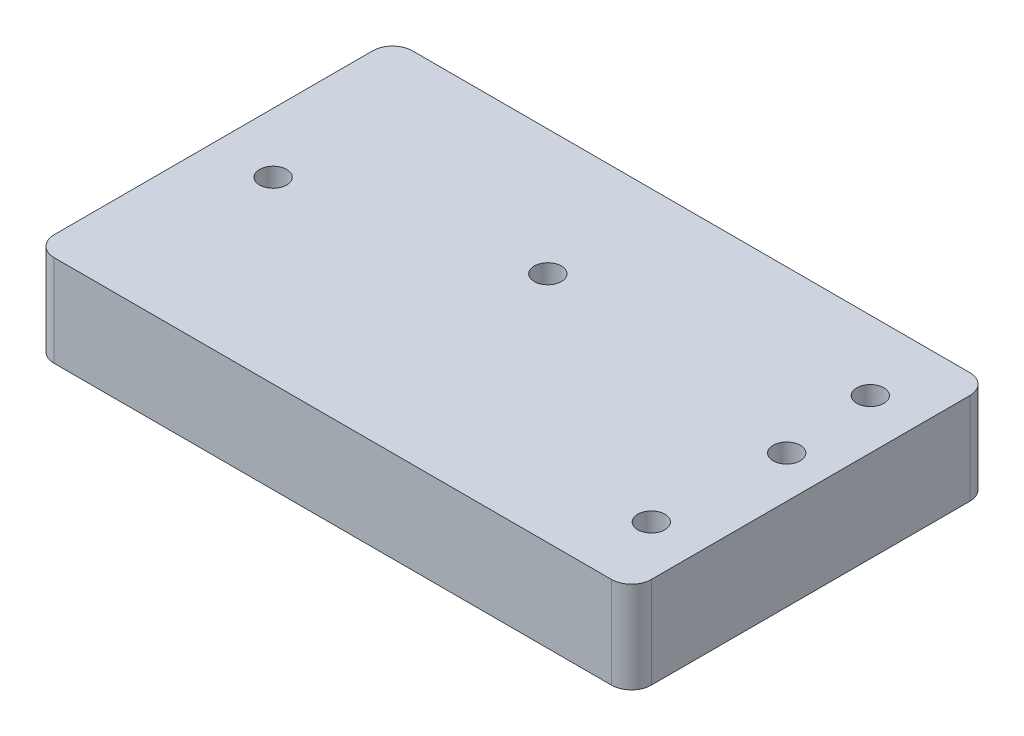
ISO-10303-21;
HEADER;
FILE_DESCRIPTION(('STEP AP214'),'2;1');
FILE_NAME('part.step','',(''),(''),'','','');
FILE_SCHEMA(('AUTOMOTIVE_DESIGN { 1 0 10303 214 1 1 1 1 }'));
ENDSEC;
DATA;
#1=APPLICATION_CONTEXT('core data for automotive mechanical design processes');
#2=APPLICATION_PROTOCOL_DEFINITION('international standard','automotive_design',2000,#1);
#3=PRODUCT_CONTEXT('',#1,'mechanical');
#4=PRODUCT('Part','Part','',(#3));
#5=PRODUCT_RELATED_PRODUCT_CATEGORY('part','',(#4));
#6=PRODUCT_DEFINITION_FORMATION('','',#4);
#7=PRODUCT_DEFINITION_CONTEXT('part definition',#1,'design');
#8=PRODUCT_DEFINITION('design','',#6,#7);
#9=PRODUCT_DEFINITION_SHAPE('','',#8);
#10=(LENGTH_UNIT() NAMED_UNIT(*) SI_UNIT(.MILLI.,.METRE.));
#11=(NAMED_UNIT(*) PLANE_ANGLE_UNIT() SI_UNIT($,.RADIAN.));
#12=(NAMED_UNIT(*) SI_UNIT($,.STERADIAN.) SOLID_ANGLE_UNIT());
#13=UNCERTAINTY_MEASURE_WITH_UNIT(LENGTH_MEASURE(1.E-05),#10,'distance_accuracy_value','');
#14=(GEOMETRIC_REPRESENTATION_CONTEXT(3) GLOBAL_UNCERTAINTY_ASSIGNED_CONTEXT((#13)) GLOBAL_UNIT_ASSIGNED_CONTEXT((#10,
#11,#12)) REPRESENTATION_CONTEXT('',''));
#15=CARTESIAN_POINT('',(0.,0.,0.));
#16=DIRECTION('',(0.,0.,1.));
#17=DIRECTION('',(1.,0.,0.));
#18=AXIS2_PLACEMENT_3D('',#15,#16,#17);
#19=CARTESIAN_POINT('',(0.,11.684,0.));
#20=DIRECTION('',(1.,0.,0.));
#21=DIRECTION('',(0.,0.,-1.));
#22=AXIS2_PLACEMENT_3D('',#19,#20,#21);
#23=PLANE('',#22);
#24=CARTESIAN_POINT('',(0.,9.017,27.94));
#25=DIRECTION('',(-1.,0.,0.));
#26=DIRECTION('',(0.,0.,1.));
#27=AXIS2_PLACEMENT_3D('',#24,#25,#26);
#28=CIRCLE('',#27,1.397);
#29=CARTESIAN_POINT('',(0.,9.017,29.337));
#30=VERTEX_POINT('',#29);
#31=EDGE_CURVE('E260',#30,#30,#28,.T.);
#32=ORIENTED_EDGE('',*,*,#31,.F.);
#33=EDGE_LOOP('',(#32));
#34=FACE_BOUND('',#33,.T.);
#35=DIRECTION('',(0.,0.,1.));
#36=VECTOR('',#35,1.);
#37=CARTESIAN_POINT('',(0.,0.,0.));
#38=LINE('',#37,#36);
#39=CARTESIAN_POINT('',(0.,0.,2.54));
#40=VERTEX_POINT('',#39);
#41=CARTESIAN_POINT('',(0.,0.,43.18));
#42=VERTEX_POINT('',#41);
#43=EDGE_CURVE('E289',#40,#42,#38,.T.);
#44=ORIENTED_EDGE('',*,*,#43,.T.);
#45=DIRECTION('',(0.,-1.,0.));
#46=VECTOR('',#45,1.);
#47=CARTESIAN_POINT('',(0.,11.684,43.18));
#48=LINE('',#47,#46);
#49=CARTESIAN_POINT('',(0.,11.684,43.18));
#50=VERTEX_POINT('',#49);
#51=EDGE_CURVE('E344',#42,#50,#48,.F.);
#52=ORIENTED_EDGE('',*,*,#51,.T.);
#53=DIRECTION('',(0.,0.,1.));
#54=VECTOR('',#53,1.);
#55=CARTESIAN_POINT('',(0.,11.684,0.));
#56=LINE('',#55,#54);
#57=CARTESIAN_POINT('',(0.,11.684,2.54));
#58=VERTEX_POINT('',#57);
#59=EDGE_CURVE('E293',#58,#50,#56,.T.);
#60=ORIENTED_EDGE('',*,*,#59,.F.);
#61=DIRECTION('',(0.,-1.,0.));
#62=VECTOR('',#61,1.);
#63=CARTESIAN_POINT('',(0.,11.684,2.54));
#64=LINE('',#63,#62);
#65=EDGE_CURVE('E340',#58,#40,#64,.T.);
#66=ORIENTED_EDGE('',*,*,#65,.T.);
#67=EDGE_LOOP('',(#44,#52,#60,#66));
#68=FACE_BOUND('',#67,.T.);
#69=ADVANCED_FACE('F140',(#34,#68),#23,.F.);
#70=CARTESIAN_POINT('',(0.,11.684,45.72));
#71=DIRECTION('',(0.,0.,-1.));
#72=DIRECTION('',(-1.,0.,0.));
#73=AXIS2_PLACEMENT_3D('',#70,#71,#72);
#74=PLANE('',#73);
#75=DIRECTION('',(1.,0.,0.));
#76=VECTOR('',#75,1.);
#77=CARTESIAN_POINT('',(0.,11.684,45.72));
#78=LINE('',#77,#76);
#79=CARTESIAN_POINT('',(2.54,11.684,45.72));
#80=VERTEX_POINT('',#79);
#81=CARTESIAN_POINT('',(73.66,11.684,45.72));
#82=VERTEX_POINT('',#81);
#83=EDGE_CURVE('E297',#80,#82,#78,.T.);
#84=ORIENTED_EDGE('',*,*,#83,.F.);
#85=DIRECTION('',(0.,-1.,0.));
#86=VECTOR('',#85,1.);
#87=CARTESIAN_POINT('',(2.54,11.684,45.72));
#88=LINE('',#87,#86);
#89=CARTESIAN_POINT('',(2.54,0.,45.72));
#90=VERTEX_POINT('',#89);
#91=EDGE_CURVE('E324',#80,#90,#88,.T.);
#92=ORIENTED_EDGE('',*,*,#91,.T.);
#93=DIRECTION('',(1.,0.,0.));
#94=VECTOR('',#93,1.);
#95=CARTESIAN_POINT('',(0.,0.,45.72));
#96=LINE('',#95,#94);
#97=CARTESIAN_POINT('',(73.66,0.,45.72));
#98=VERTEX_POINT('',#97);
#99=EDGE_CURVE('E312',#90,#98,#96,.T.);
#100=ORIENTED_EDGE('',*,*,#99,.T.);
#101=DIRECTION('',(0.,-1.,0.));
#102=VECTOR('',#101,1.);
#103=CARTESIAN_POINT('',(73.66,11.684,45.72));
#104=LINE('',#103,#102);
#105=EDGE_CURVE('E308',#98,#82,#104,.F.);
#106=ORIENTED_EDGE('',*,*,#105,.T.);
#107=EDGE_LOOP('',(#84,#92,#100,#106));
#108=FACE_BOUND('',#107,.T.);
#109=ADVANCED_FACE('F389',(#108),#74,.F.);
#110=CARTESIAN_POINT('',(76.2,11.684,0.));
#111=DIRECTION('',(-1.,0.,0.));
#112=DIRECTION('',(0.,0.,1.));
#113=AXIS2_PLACEMENT_3D('',#110,#111,#112);
#114=PLANE('',#113);
#115=DIRECTION('',(0.,0.,-1.));
#116=VECTOR('',#115,1.);
#117=CARTESIAN_POINT('',(76.2,11.684,0.));
#118=LINE('',#117,#116);
#119=CARTESIAN_POINT('',(76.2,11.684,43.18));
#120=VERTEX_POINT('',#119);
#121=CARTESIAN_POINT('',(76.2,11.684,2.54));
#122=VERTEX_POINT('',#121);
#123=EDGE_CURVE('E302',#120,#122,#118,.T.);
#124=ORIENTED_EDGE('',*,*,#123,.F.);
#125=DIRECTION('',(0.,-1.,0.));
#126=VECTOR('',#125,1.);
#127=CARTESIAN_POINT('',(76.2,11.684,43.18));
#128=LINE('',#127,#126);
#129=CARTESIAN_POINT('',(76.2,0.,43.18));
#130=VERTEX_POINT('',#129);
#131=EDGE_CURVE('E361',#120,#130,#128,.T.);
#132=ORIENTED_EDGE('',*,*,#131,.T.);
#133=DIRECTION('',(0.,0.,-1.));
#134=VECTOR('',#133,1.);
#135=CARTESIAN_POINT('',(76.2,0.,0.));
#136=LINE('',#135,#134);
#137=CARTESIAN_POINT('',(76.2,0.,2.54));
#138=VERTEX_POINT('',#137);
#139=EDGE_CURVE('E316',#130,#138,#136,.T.);
#140=ORIENTED_EDGE('',*,*,#139,.T.);
#141=DIRECTION('',(0.,-1.,0.));
#142=VECTOR('',#141,1.);
#143=CARTESIAN_POINT('',(76.2,11.684,2.54));
#144=LINE('',#143,#142);
#145=EDGE_CURVE('E358',#138,#122,#144,.F.);
#146=ORIENTED_EDGE('',*,*,#145,.T.);
#147=EDGE_LOOP('',(#124,#132,#140,#146));
#148=FACE_BOUND('',#147,.T.);
#149=ADVANCED_FACE('F397',(#148),#114,.F.);
#150=CARTESIAN_POINT('',(0.,11.684,0.));
#151=DIRECTION('',(0.,0.,1.));
#152=DIRECTION('',(1.,0.,0.));
#153=AXIS2_PLACEMENT_3D('',#150,#151,#152);
#154=PLANE('',#153);
#155=DIRECTION('',(-1.,0.,0.));
#156=VECTOR('',#155,1.);
#157=CARTESIAN_POINT('',(0.,0.,0.));
#158=LINE('',#157,#156);
#159=CARTESIAN_POINT('',(73.66,0.,0.));
#160=VERTEX_POINT('',#159);
#161=CARTESIAN_POINT('',(2.54,0.,0.));
#162=VERTEX_POINT('',#161);
#163=EDGE_CURVE('E298',#160,#162,#158,.T.);
#164=ORIENTED_EDGE('',*,*,#163,.T.);
#165=DIRECTION('',(0.,-1.,0.));
#166=VECTOR('',#165,1.);
#167=CARTESIAN_POINT('',(2.54,11.684,0.));
#168=LINE('',#167,#166);
#169=CARTESIAN_POINT('',(2.54,11.684,0.));
#170=VERTEX_POINT('',#169);
#171=EDGE_CURVE('E12',#162,#170,#168,.F.);
#172=ORIENTED_EDGE('',*,*,#171,.T.);
#173=DIRECTION('',(-1.,0.,0.));
#174=VECTOR('',#173,1.);
#175=CARTESIAN_POINT('',(0.,11.684,0.));
#176=LINE('',#175,#174);
#177=CARTESIAN_POINT('',(73.66,11.684,0.));
#178=VERTEX_POINT('',#177);
#179=EDGE_CURVE('E305',#178,#170,#176,.T.);
#180=ORIENTED_EDGE('',*,*,#179,.F.);
#181=DIRECTION('',(0.,-1.,0.));
#182=VECTOR('',#181,1.);
#183=CARTESIAN_POINT('',(73.66,11.684,0.));
#184=LINE('',#183,#182);
#185=EDGE_CURVE('E149',#178,#160,#184,.T.);
#186=ORIENTED_EDGE('',*,*,#185,.T.);
#187=EDGE_LOOP('',(#164,#172,#180,#186));
#188=FACE_BOUND('',#187,.T.);
#189=ADVANCED_FACE('F368',(#188),#154,.F.);
#190=CARTESIAN_POINT('',(0.,11.684,0.));
#191=DIRECTION('',(0.,1.,0.));
#192=DIRECTION('',(0.,0.,1.));
#193=AXIS2_PLACEMENT_3D('',#190,#191,#192);
#194=PLANE('',#193);
#195=CARTESIAN_POINT('',(35.814,11.684,16.002));
#196=DIRECTION('',(0.,1.,0.));
#197=DIRECTION('',(0.,0.,1.));
#198=AXIS2_PLACEMENT_3D('',#195,#196,#197);
#199=CIRCLE('',#198,1.72719999999999);
#200=CARTESIAN_POINT('',(35.814,11.684,17.7292));
#201=VERTEX_POINT('',#200);
#202=EDGE_CURVE('E689',#201,#201,#199,.T.);
#203=ORIENTED_EDGE('',*,*,#202,.F.);
#204=EDGE_LOOP('',(#203));
#205=FACE_BOUND('',#204,.T.);
#206=CARTESIAN_POINT('',(70.866,11.684,20.574));
#207=DIRECTION('',(0.,1.,0.));
#208=DIRECTION('',(0.,0.,1.));
#209=AXIS2_PLACEMENT_3D('',#206,#207,#208);
#210=CIRCLE('',#209,1.7272);
#211=CARTESIAN_POINT('',(70.866,11.684,22.3012));
#212=VERTEX_POINT('',#211);
#213=EDGE_CURVE('E237',#212,#212,#210,.T.);
#214=ORIENTED_EDGE('',*,*,#213,.F.);
#215=EDGE_LOOP('',(#214));
#216=FACE_BOUND('',#215,.T.);
#217=CARTESIAN_POINT('',(69.85,11.684,36.83));
#218=DIRECTION('',(0.,1.,0.));
#219=DIRECTION('',(0.,0.,1.));
#220=AXIS2_PLACEMENT_3D('',#217,#218,#219);
#221=CIRCLE('',#220,1.7272);
#222=CARTESIAN_POINT('',(69.85,11.684,38.5572));
#223=VERTEX_POINT('',#222);
#224=EDGE_CURVE('E265',#223,#223,#221,.T.);
#225=ORIENTED_EDGE('',*,*,#224,.F.);
#226=EDGE_LOOP('',(#225));
#227=FACE_BOUND('',#226,.T.);
#228=CARTESIAN_POINT('',(69.85,11.684,8.89));
#229=DIRECTION('',(0.,1.,0.));
#230=DIRECTION('',(0.,0.,1.));
#231=AXIS2_PLACEMENT_3D('',#228,#229,#230);
#232=CIRCLE('',#231,1.7272);
#233=CARTESIAN_POINT('',(69.85,11.684,10.6172));
#234=VERTEX_POINT('',#233);
#235=EDGE_CURVE('E273',#234,#234,#232,.T.);
#236=ORIENTED_EDGE('',*,*,#235,.F.);
#237=EDGE_LOOP('',(#236));
#238=FACE_BOUND('',#237,.T.);
#239=CARTESIAN_POINT('',(7.62,11.684,22.86));
#240=DIRECTION('',(0.,1.,0.));
#241=DIRECTION('',(0.,0.,1.));
#242=AXIS2_PLACEMENT_3D('',#239,#240,#241);
#243=CIRCLE('',#242,1.7272);
#244=CARTESIAN_POINT('',(7.62,11.684,24.5872));
#245=VERTEX_POINT('',#244);
#246=EDGE_CURVE('E281',#245,#245,#243,.T.);
#247=ORIENTED_EDGE('',*,*,#246,.F.);
#248=EDGE_LOOP('',(#247));
#249=FACE_BOUND('',#248,.T.);
#250=ORIENTED_EDGE('',*,*,#59,.T.);
#251=CARTESIAN_POINT('',(2.54,11.684,43.18));
#252=DIRECTION('',(0.,1.,0.));
#253=DIRECTION('',(0.,0.,1.));
#254=AXIS2_PLACEMENT_3D('',#251,#252,#253);
#255=CIRCLE('',#254,2.54);
#256=EDGE_CURVE('E355',#50,#80,#255,.T.);
#257=ORIENTED_EDGE('',*,*,#256,.T.);
#258=ORIENTED_EDGE('',*,*,#83,.T.);
#259=CARTESIAN_POINT('',(73.66,11.684,43.18));
#260=DIRECTION('',(0.,1.,0.));
#261=DIRECTION('',(0.,0.,1.));
#262=AXIS2_PLACEMENT_3D('',#259,#260,#261);
#263=CIRCLE('',#262,2.54);
#264=EDGE_CURVE('E352',#82,#120,#263,.T.);
#265=ORIENTED_EDGE('',*,*,#264,.T.);
#266=ORIENTED_EDGE('',*,*,#123,.T.);
#267=CARTESIAN_POINT('',(73.66,11.684,2.54));
#268=DIRECTION('',(0.,1.,0.));
#269=DIRECTION('',(0.,0.,1.));
#270=AXIS2_PLACEMENT_3D('',#267,#268,#269);
#271=CIRCLE('',#270,2.54);
#272=EDGE_CURVE('E161',#122,#178,#271,.T.);
#273=ORIENTED_EDGE('',*,*,#272,.T.);
#274=ORIENTED_EDGE('',*,*,#179,.T.);
#275=CARTESIAN_POINT('',(2.54,11.684,2.54));
#276=DIRECTION('',(0.,1.,0.));
#277=DIRECTION('',(0.,0.,1.));
#278=AXIS2_PLACEMENT_3D('',#275,#276,#277);
#279=CIRCLE('',#278,2.54);
#280=EDGE_CURVE('E349',#170,#58,#279,.T.);
#281=ORIENTED_EDGE('',*,*,#280,.T.);
#282=EDGE_LOOP('',(#250,#257,#258,#265,#266,#273,#274,#281));
#283=FACE_BOUND('',#282,.T.);
#284=ADVANCED_FACE('F383',(#205,#216,#227,#238,#249,#283),#194,.T.);
#285=CARTESIAN_POINT('',(0.,0.,0.));
#286=DIRECTION('',(0.,1.,0.));
#287=DIRECTION('',(0.,0.,1.));
#288=AXIS2_PLACEMENT_3D('',#285,#286,#287);
#289=PLANE('',#288);
#290=CARTESIAN_POINT('',(35.814,0.,16.002));
#291=DIRECTION('',(0.,-1.,0.));
#292=DIRECTION('',(0.,0.,-1.));
#293=AXIS2_PLACEMENT_3D('',#290,#291,#292);
#294=CIRCLE('',#293,1.72719999999999);
#295=CARTESIAN_POINT('',(35.814,0.,14.2748));
#296=VERTEX_POINT('',#295);
#297=EDGE_CURVE('E710',#296,#296,#294,.T.);
#298=ORIENTED_EDGE('',*,*,#297,.F.);
#299=EDGE_LOOP('',(#298));
#300=FACE_BOUND('',#299,.T.);
#301=CARTESIAN_POINT('',(70.866,0.,20.574));
#302=DIRECTION('',(0.,-1.,0.));
#303=DIRECTION('',(0.,0.,-1.));
#304=AXIS2_PLACEMENT_3D('',#301,#302,#303);
#305=CIRCLE('',#304,1.7272);
#306=CARTESIAN_POINT('',(70.866,0.,18.8468));
#307=VERTEX_POINT('',#306);
#308=EDGE_CURVE('E702',#307,#307,#305,.T.);
#309=ORIENTED_EDGE('',*,*,#308,.F.);
#310=EDGE_LOOP('',(#309));
#311=FACE_BOUND('',#310,.T.);
#312=CARTESIAN_POINT('',(3.175,0.,3.5052));
#313=DIRECTION('',(0.,-1.,0.));
#314=DIRECTION('',(0.,0.,-1.));
#315=AXIS2_PLACEMENT_3D('',#312,#313,#314);
#316=CIRCLE('',#315,1.1303);
#317=CARTESIAN_POINT('',(3.175,0.,2.3749));
#318=VERTEX_POINT('',#317);
#319=EDGE_CURVE('E228',#318,#318,#316,.T.);
#320=ORIENTED_EDGE('',*,*,#319,.F.);
#321=EDGE_LOOP('',(#320));
#322=FACE_BOUND('',#321,.T.);
#323=CARTESIAN_POINT('',(3.175,0.,37.1602));
#324=DIRECTION('',(0.,-1.,0.));
#325=DIRECTION('',(0.,0.,-1.));
#326=AXIS2_PLACEMENT_3D('',#323,#324,#325);
#327=CIRCLE('',#326,1.1303);
#328=CARTESIAN_POINT('',(3.175,0.,36.0299));
#329=VERTEX_POINT('',#328);
#330=EDGE_CURVE('E227',#329,#329,#327,.T.);
#331=ORIENTED_EDGE('',*,*,#330,.F.);
#332=EDGE_LOOP('',(#331));
#333=FACE_BOUND('',#332,.T.);
#334=CARTESIAN_POINT('',(14.605,0.,3.5052));
#335=DIRECTION('',(0.,-1.,0.));
#336=DIRECTION('',(0.,0.,-1.));
#337=AXIS2_PLACEMENT_3D('',#334,#335,#336);
#338=CIRCLE('',#337,1.1303);
#339=CARTESIAN_POINT('',(14.605,0.,2.3749));
#340=VERTEX_POINT('',#339);
#341=EDGE_CURVE('E244',#340,#340,#338,.T.);
#342=ORIENTED_EDGE('',*,*,#341,.F.);
#343=EDGE_LOOP('',(#342));
#344=FACE_BOUND('',#343,.T.);
#345=CARTESIAN_POINT('',(14.605,0.,37.1602));
#346=DIRECTION('',(0.,-1.,0.));
#347=DIRECTION('',(0.,0.,-1.));
#348=AXIS2_PLACEMENT_3D('',#345,#346,#347);
#349=CIRCLE('',#348,1.1303);
#350=CARTESIAN_POINT('',(14.605,0.,36.0299));
#351=VERTEX_POINT('',#350);
#352=EDGE_CURVE('E252',#351,#351,#349,.T.);
#353=ORIENTED_EDGE('',*,*,#352,.F.);
#354=EDGE_LOOP('',(#353));
#355=FACE_BOUND('',#354,.T.);
#356=CARTESIAN_POINT('',(69.85,0.,36.83));
#357=DIRECTION('',(0.,1.,0.));
#358=DIRECTION('',(0.,0.,1.));
#359=AXIS2_PLACEMENT_3D('',#356,#357,#358);
#360=CIRCLE('',#359,1.7272);
#361=CARTESIAN_POINT('',(69.85,0.,38.5572));
#362=VERTEX_POINT('',#361);
#363=EDGE_CURVE('E269',#362,#362,#360,.T.);
#364=ORIENTED_EDGE('',*,*,#363,.T.);
#365=EDGE_LOOP('',(#364));
#366=FACE_BOUND('',#365,.T.);
#367=CARTESIAN_POINT('',(69.85,0.,8.89));
#368=DIRECTION('',(0.,1.,0.));
#369=DIRECTION('',(0.,0.,1.));
#370=AXIS2_PLACEMENT_3D('',#367,#368,#369);
#371=CIRCLE('',#370,1.7272);
#372=CARTESIAN_POINT('',(69.85,0.,10.6172));
#373=VERTEX_POINT('',#372);
#374=EDGE_CURVE('E277',#373,#373,#371,.T.);
#375=ORIENTED_EDGE('',*,*,#374,.T.);
#376=EDGE_LOOP('',(#375));
#377=FACE_BOUND('',#376,.T.);
#378=CARTESIAN_POINT('',(7.62,0.,22.86));
#379=DIRECTION('',(0.,1.,0.));
#380=DIRECTION('',(0.,0.,1.));
#381=AXIS2_PLACEMENT_3D('',#378,#379,#380);
#382=CIRCLE('',#381,1.7272);
#383=CARTESIAN_POINT('',(7.62,0.,24.5872));
#384=VERTEX_POINT('',#383);
#385=EDGE_CURVE('E285',#384,#384,#382,.T.);
#386=ORIENTED_EDGE('',*,*,#385,.T.);
#387=EDGE_LOOP('',(#386));
#388=FACE_BOUND('',#387,.T.);
#389=ORIENTED_EDGE('',*,*,#99,.F.);
#390=CARTESIAN_POINT('',(2.54,0.,43.18));
#391=DIRECTION('',(0.,1.,0.));
#392=DIRECTION('',(0.,0.,1.));
#393=AXIS2_PLACEMENT_3D('',#390,#391,#392);
#394=CIRCLE('',#393,2.54);
#395=EDGE_CURVE('E337',#90,#42,#394,.F.);
#396=ORIENTED_EDGE('',*,*,#395,.T.);
#397=ORIENTED_EDGE('',*,*,#43,.F.);
#398=CARTESIAN_POINT('',(2.54,0.,2.54));
#399=DIRECTION('',(0.,1.,0.));
#400=DIRECTION('',(0.,0.,1.));
#401=AXIS2_PLACEMENT_3D('',#398,#399,#400);
#402=CIRCLE('',#401,2.54);
#403=EDGE_CURVE('E331',#40,#162,#402,.F.);
#404=ORIENTED_EDGE('',*,*,#403,.T.);
#405=ORIENTED_EDGE('',*,*,#163,.F.);
#406=CARTESIAN_POINT('',(73.66,0.,2.54));
#407=DIRECTION('',(0.,1.,0.));
#408=DIRECTION('',(0.,0.,1.));
#409=AXIS2_PLACEMENT_3D('',#406,#407,#408);
#410=CIRCLE('',#409,2.54);
#411=EDGE_CURVE('E328',#160,#138,#410,.F.);
#412=ORIENTED_EDGE('',*,*,#411,.T.);
#413=ORIENTED_EDGE('',*,*,#139,.F.);
#414=CARTESIAN_POINT('',(73.66,0.,43.18));
#415=DIRECTION('',(0.,1.,0.));
#416=DIRECTION('',(0.,0.,1.));
#417=AXIS2_PLACEMENT_3D('',#414,#415,#416);
#418=CIRCLE('',#417,2.54);
#419=EDGE_CURVE('E334',#130,#98,#418,.F.);
#420=ORIENTED_EDGE('',*,*,#419,.T.);
#421=EDGE_LOOP('',(#389,#396,#397,#404,#405,#412,#413,#420));
#422=FACE_BOUND('',#421,.T.);
#423=ADVANCED_FACE('F372',(#300,#311,#322,#333,#344,#355,#366,#377,#388,#422),#289,.F.);
#424=CARTESIAN_POINT('',(7.62,0.,22.86));
#425=DIRECTION('',(0.,1.,0.));
#426=DIRECTION('',(0.,0.,1.));
#427=AXIS2_PLACEMENT_3D('',#424,#425,#426);
#428=CYLINDRICAL_SURFACE('',#427,1.7272);
#429=ORIENTED_EDGE('',*,*,#385,.F.);
#430=EDGE_LOOP('',(#429));
#431=FACE_BOUND('',#430,.T.);
#432=ORIENTED_EDGE('',*,*,#246,.T.);
#433=EDGE_LOOP('',(#432));
#434=FACE_BOUND('',#433,.T.);
#435=ADVANCED_FACE('F569',(#431,#434),#428,.F.);
#436=CARTESIAN_POINT('',(69.85,0.,8.89));
#437=DIRECTION('',(0.,1.,0.));
#438=DIRECTION('',(0.,0.,1.));
#439=AXIS2_PLACEMENT_3D('',#436,#437,#438);
#440=CYLINDRICAL_SURFACE('',#439,1.7272);
#441=ORIENTED_EDGE('',*,*,#374,.F.);
#442=EDGE_LOOP('',(#441));
#443=FACE_BOUND('',#442,.T.);
#444=ORIENTED_EDGE('',*,*,#235,.T.);
#445=EDGE_LOOP('',(#444));
#446=FACE_BOUND('',#445,.T.);
#447=ADVANCED_FACE('F559',(#443,#446),#440,.F.);
#448=CARTESIAN_POINT('',(69.85,0.,36.83));
#449=DIRECTION('',(0.,1.,0.));
#450=DIRECTION('',(0.,0.,1.));
#451=AXIS2_PLACEMENT_3D('',#448,#449,#450);
#452=CYLINDRICAL_SURFACE('',#451,1.7272);
#453=ORIENTED_EDGE('',*,*,#363,.F.);
#454=EDGE_LOOP('',(#453));
#455=FACE_BOUND('',#454,.T.);
#456=ORIENTED_EDGE('',*,*,#224,.T.);
#457=EDGE_LOOP('',(#456));
#458=FACE_BOUND('',#457,.T.);
#459=ADVANCED_FACE('F549',(#455,#458),#452,.F.);
#460=CARTESIAN_POINT('',(15.24,9.017,27.94));
#461=DIRECTION('',(-1.,0.,0.));
#462=DIRECTION('',(0.,0.,1.));
#463=AXIS2_PLACEMENT_3D('',#460,#461,#462);
#464=CYLINDRICAL_SURFACE('',#463,1.397);
#465=CARTESIAN_POINT('',(15.24,9.017,27.94));
#466=DIRECTION('',(-1.,0.,0.));
#467=DIRECTION('',(0.,0.,1.));
#468=AXIS2_PLACEMENT_3D('',#465,#466,#467);
#469=CIRCLE('',#468,1.397);
#470=CARTESIAN_POINT('',(15.24,9.017,29.337));
#471=VERTEX_POINT('',#470);
#472=EDGE_CURVE('E261',#471,#471,#469,.T.);
#473=CARTESIAN_POINT('',(15.24,9.017,29.337));
#474=CARTESIAN_POINT('',(15.08125,9.017,29.337));
#475=CARTESIAN_POINT('',(14.9225,9.017,29.337));
#476=CARTESIAN_POINT('',(14.605,9.017,29.337));
#477=CARTESIAN_POINT('',(14.44625,9.017,29.337));
#478=CARTESIAN_POINT('',(14.12875,9.017,29.337));
#479=CARTESIAN_POINT('',(13.97,9.017,29.337));
#480=CARTESIAN_POINT('',(13.6525,9.017,29.337));
#481=CARTESIAN_POINT('',(13.49375,9.017,29.337));
#482=CARTESIAN_POINT('',(13.17625,9.017,29.337));
#483=CARTESIAN_POINT('',(13.0175,9.017,29.337));
#484=CARTESIAN_POINT('',(12.7,9.017,29.337));
#485=CARTESIAN_POINT('',(12.54125,9.017,29.337));
#486=CARTESIAN_POINT('',(12.22375,9.017,29.337));
#487=CARTESIAN_POINT('',(12.065,9.017,29.337));
#488=CARTESIAN_POINT('',(11.7475,9.017,29.337));
#489=CARTESIAN_POINT('',(11.58875,9.017,29.337));
#490=CARTESIAN_POINT('',(11.27125,9.017,29.337));
#491=CARTESIAN_POINT('',(11.1125,9.017,29.337));
#492=CARTESIAN_POINT('',(10.795,9.017,29.337));
#493=CARTESIAN_POINT('',(10.63625,9.017,29.337));
#494=CARTESIAN_POINT('',(10.31875,9.017,29.337));
#495=CARTESIAN_POINT('',(10.16,9.017,29.337));
#496=CARTESIAN_POINT('',(9.8425,9.017,29.337));
#497=CARTESIAN_POINT('',(9.68375,9.017,29.337));
#498=CARTESIAN_POINT('',(9.36625,9.017,29.337));
#499=CARTESIAN_POINT('',(9.2075,9.017,29.337));
#500=CARTESIAN_POINT('',(8.89,9.017,29.337));
#501=CARTESIAN_POINT('',(8.73125,9.017,29.337));
#502=CARTESIAN_POINT('',(8.41375,9.017,29.337));
#503=CARTESIAN_POINT('',(8.255,9.017,29.337));
#504=CARTESIAN_POINT('',(7.9375,9.017,29.337));
#505=CARTESIAN_POINT('',(7.77875,9.017,29.337));
#506=CARTESIAN_POINT('',(7.46125,9.017,29.337));
#507=CARTESIAN_POINT('',(7.3025,9.017,29.337));
#508=CARTESIAN_POINT('',(6.985,9.017,29.337));
#509=CARTESIAN_POINT('',(6.82625,9.017,29.337));
#510=CARTESIAN_POINT('',(6.50875,9.017,29.337));
#511=CARTESIAN_POINT('',(6.35,9.017,29.337));
#512=CARTESIAN_POINT('',(6.0325,9.017,29.337));
#513=CARTESIAN_POINT('',(5.87375,9.017,29.337));
#514=CARTESIAN_POINT('',(5.55625,9.017,29.337));
#515=CARTESIAN_POINT('',(5.3975,9.017,29.337));
#516=CARTESIAN_POINT('',(5.08,9.017,29.337));
#517=CARTESIAN_POINT('',(4.92125,9.017,29.337));
#518=CARTESIAN_POINT('',(4.60375,9.017,29.337));
#519=CARTESIAN_POINT('',(4.445,9.017,29.337));
#520=CARTESIAN_POINT('',(4.1275,9.017,29.337));
#521=CARTESIAN_POINT('',(3.96875,9.017,29.337));
#522=CARTESIAN_POINT('',(3.65125,9.017,29.337));
#523=CARTESIAN_POINT('',(3.4925,9.017,29.337));
#524=CARTESIAN_POINT('',(3.175,9.017,29.337));
#525=CARTESIAN_POINT('',(3.01625,9.017,29.337));
#526=CARTESIAN_POINT('',(2.69875,9.017,29.337));
#527=CARTESIAN_POINT('',(2.54,9.017,29.337));
#528=CARTESIAN_POINT('',(2.2225,9.017,29.337));
#529=CARTESIAN_POINT('',(2.06375,9.017,29.337));
#530=CARTESIAN_POINT('',(1.74625,9.017,29.337));
#531=CARTESIAN_POINT('',(1.5875,9.017,29.337));
#532=CARTESIAN_POINT('',(1.27,9.017,29.337));
#533=CARTESIAN_POINT('',(1.11125,9.017,29.337));
#534=CARTESIAN_POINT('',(0.79375,9.017,29.337));
#535=CARTESIAN_POINT('',(0.634999999999999,9.017,29.337));
#536=CARTESIAN_POINT('',(0.3175,9.017,29.337));
#537=CARTESIAN_POINT('',(0.15875,9.017,29.337));
#538=CARTESIAN_POINT('',(0.,9.017,29.337));
#539=B_SPLINE_CURVE_WITH_KNOTS('',3,(#473,#474,#475,#476,#477,#478,#479,#480,#481,#482,#483,
#484,#485,#486,#487,#488,#489,#490,#491,#492,#493,#494,#495,#496,#497,#498,#499,#500,#501,#502,
#503,#504,#505,#506,#507,#508,#509,#510,#511,#512,#513,#514,#515,#516,#517,#518,#519,#520,#521,
#522,#523,#524,#525,#526,#527,#528,#529,#530,#531,#532,#533,#534,#535,#536,#537,#538),
.UNSPECIFIED.,.F.,.F.,(4,2,2,2,2,2,2,2,2,2,2,2,2,2,2,2,2,2,2,2,2,2,2,2,2,2,2,2,2,2,2,2,4),(0.,
0.476250000000001,0.9525,1.42875,1.905,2.38125,2.8575,3.33375,3.81,4.28625,4.7625,5.23875,5.715,
6.19125,6.6675,7.14375,7.62,8.09625,8.5725,9.04875,9.525,10.00125,10.4775,10.95375,11.43,
11.90625,12.3825,12.85875,13.335,13.81125,14.2875,14.76375,15.24),.UNSPECIFIED.);
#540=EDGE_CURVE('BSEAM539',#471,#30,#539,.T.);
#541=ORIENTED_EDGE('',*,*,#472,.F.);
#542=ORIENTED_EDGE('',*,*,#31,.T.);
#543=ORIENTED_EDGE('',*,*,#540,.T.);
#544=ORIENTED_EDGE('',*,*,#540,.F.);
#545=EDGE_LOOP('',(#541,#543,#542,#544));
#546=FACE_BOUND('',#545,.T.);
#547=ADVANCED_FACE('F539',(#546),#464,.F.);
#548=CARTESIAN_POINT('',(15.24,9.017,27.94));
#549=DIRECTION('',(-1.,0.,0.));
#550=DIRECTION('',(0.,0.,1.));
#551=AXIS2_PLACEMENT_3D('',#548,#549,#550);
#552=PLANE('',#551);
#553=ORIENTED_EDGE('',*,*,#472,.T.);
#554=EDGE_LOOP('',(#553));
#555=FACE_BOUND('',#554,.T.);
#556=ADVANCED_FACE('F529',(#555),#552,.T.);
#557=CARTESIAN_POINT('',(14.605,7.62,37.1602));
#558=DIRECTION('',(0.,-1.,0.));
#559=DIRECTION('',(0.,0.,-1.));
#560=AXIS2_PLACEMENT_3D('',#557,#558,#559);
#561=CONICAL_SURFACE('',#560,1.1303,1.02974425867665);
#562=CARTESIAN_POINT('',(14.605,8.29915275768685,37.1602));
#563=VERTEX_POINT('',#562);
#564=VERTEX_LOOP('',#563);
#565=FACE_BOUND('',#564,.T.);
#566=CARTESIAN_POINT('',(14.605,7.62,37.1602));
#567=DIRECTION('',(0.,-1.,0.));
#568=DIRECTION('',(0.,0.,-1.));
#569=AXIS2_PLACEMENT_3D('',#566,#567,#568);
#570=CIRCLE('',#569,1.1303);
#571=CARTESIAN_POINT('',(14.605,7.62,36.0299));
#572=VERTEX_POINT('',#571);
#573=EDGE_CURVE('E256',#572,#572,#570,.T.);
#574=ORIENTED_EDGE('',*,*,#573,.T.);
#575=EDGE_LOOP('',(#574));
#576=FACE_BOUND('',#575,.T.);
#577=ADVANCED_FACE('F519',(#565,#576),#561,.F.);
#578=CARTESIAN_POINT('',(14.605,0.,37.1602));
#579=DIRECTION('',(0.,-1.,0.));
#580=DIRECTION('',(0.,0.,-1.));
#581=AXIS2_PLACEMENT_3D('',#578,#579,#580);
#582=CYLINDRICAL_SURFACE('',#581,1.1303);
#583=ORIENTED_EDGE('',*,*,#573,.F.);
#584=EDGE_LOOP('',(#583));
#585=FACE_BOUND('',#584,.T.);
#586=ORIENTED_EDGE('',*,*,#352,.T.);
#587=EDGE_LOOP('',(#586));
#588=FACE_BOUND('',#587,.T.);
#589=ADVANCED_FACE('F509',(#585,#588),#582,.F.);
#590=CARTESIAN_POINT('',(14.605,7.62,3.5052));
#591=DIRECTION('',(0.,-1.,0.));
#592=DIRECTION('',(0.,0.,-1.));
#593=AXIS2_PLACEMENT_3D('',#590,#591,#592);
#594=CONICAL_SURFACE('',#593,1.1303,1.02974425867665);
#595=CARTESIAN_POINT('',(14.605,8.29915275768685,3.5052));
#596=VERTEX_POINT('',#595);
#597=VERTEX_LOOP('',#596);
#598=FACE_BOUND('',#597,.T.);
#599=CARTESIAN_POINT('',(14.605,7.62,3.5052));
#600=DIRECTION('',(0.,-1.,0.));
#601=DIRECTION('',(0.,0.,-1.));
#602=AXIS2_PLACEMENT_3D('',#599,#600,#601);
#603=CIRCLE('',#602,1.1303);
#604=CARTESIAN_POINT('',(14.605,7.62,2.3749));
#605=VERTEX_POINT('',#604);
#606=EDGE_CURVE('E248',#605,#605,#603,.T.);
#607=ORIENTED_EDGE('',*,*,#606,.T.);
#608=EDGE_LOOP('',(#607));
#609=FACE_BOUND('',#608,.T.);
#610=ADVANCED_FACE('F499',(#598,#609),#594,.F.);
#611=CARTESIAN_POINT('',(14.605,0.,3.5052));
#612=DIRECTION('',(0.,-1.,0.));
#613=DIRECTION('',(0.,0.,-1.));
#614=AXIS2_PLACEMENT_3D('',#611,#612,#613);
#615=CYLINDRICAL_SURFACE('',#614,1.1303);
#616=ORIENTED_EDGE('',*,*,#606,.F.);
#617=EDGE_LOOP('',(#616));
#618=FACE_BOUND('',#617,.T.);
#619=ORIENTED_EDGE('',*,*,#341,.T.);
#620=EDGE_LOOP('',(#619));
#621=FACE_BOUND('',#620,.T.);
#622=ADVANCED_FACE('F489',(#618,#621),#615,.F.);
#623=CARTESIAN_POINT('',(3.175,7.62,37.1602));
#624=DIRECTION('',(0.,-1.,0.));
#625=DIRECTION('',(0.,0.,-1.));
#626=AXIS2_PLACEMENT_3D('',#623,#624,#625);
#627=CONICAL_SURFACE('',#626,1.1303,1.02974425867665);
#628=CARTESIAN_POINT('',(3.175,8.29915275768685,37.1602));
#629=VERTEX_POINT('',#628);
#630=VERTEX_LOOP('',#629);
#631=FACE_BOUND('',#630,.T.);
#632=CARTESIAN_POINT('',(3.175,7.62,37.1602));
#633=DIRECTION('',(0.,-1.,0.));
#634=DIRECTION('',(0.,0.,-1.));
#635=AXIS2_PLACEMENT_3D('',#632,#633,#634);
#636=CIRCLE('',#635,1.1303);
#637=CARTESIAN_POINT('',(3.175,7.62,36.0299));
#638=VERTEX_POINT('',#637);
#639=EDGE_CURVE('E234',#638,#638,#636,.T.);
#640=ORIENTED_EDGE('',*,*,#639,.T.);
#641=EDGE_LOOP('',(#640));
#642=FACE_BOUND('',#641,.T.);
#643=ADVANCED_FACE('F479',(#631,#642),#627,.F.);
#644=CARTESIAN_POINT('',(3.175,0.,37.1602));
#645=DIRECTION('',(0.,-1.,0.));
#646=DIRECTION('',(0.,0.,-1.));
#647=AXIS2_PLACEMENT_3D('',#644,#645,#646);
#648=CYLINDRICAL_SURFACE('',#647,1.1303);
#649=ORIENTED_EDGE('',*,*,#639,.F.);
#650=EDGE_LOOP('',(#649));
#651=FACE_BOUND('',#650,.T.);
#652=ORIENTED_EDGE('',*,*,#330,.T.);
#653=EDGE_LOOP('',(#652));
#654=FACE_BOUND('',#653,.T.);
#655=ADVANCED_FACE('F220',(#651,#654),#648,.F.);
#656=CARTESIAN_POINT('',(3.175,7.62,3.5052));
#657=DIRECTION('',(0.,-1.,0.));
#658=DIRECTION('',(0.,0.,-1.));
#659=AXIS2_PLACEMENT_3D('',#656,#657,#658);
#660=CONICAL_SURFACE('',#659,1.1303,1.02974425867665);
#661=CARTESIAN_POINT('',(3.175,8.29915275768685,3.5052));
#662=VERTEX_POINT('',#661);
#663=VERTEX_LOOP('',#662);
#664=FACE_BOUND('',#663,.T.);
#665=CARTESIAN_POINT('',(3.175,7.62,3.5052));
#666=DIRECTION('',(0.,-1.,0.));
#667=DIRECTION('',(0.,0.,-1.));
#668=AXIS2_PLACEMENT_3D('',#665,#666,#667);
#669=CIRCLE('',#668,1.1303);
#670=CARTESIAN_POINT('',(3.175,7.62,2.3749));
#671=VERTEX_POINT('',#670);
#672=EDGE_CURVE('E224',#671,#671,#669,.T.);
#673=ORIENTED_EDGE('',*,*,#672,.T.);
#674=EDGE_LOOP('',(#673));
#675=FACE_BOUND('',#674,.T.);
#676=ADVANCED_FACE('F216',(#664,#675),#660,.F.);
#677=CARTESIAN_POINT('',(3.175,0.,3.5052));
#678=DIRECTION('',(0.,-1.,0.));
#679=DIRECTION('',(0.,0.,-1.));
#680=AXIS2_PLACEMENT_3D('',#677,#678,#679);
#681=CYLINDRICAL_SURFACE('',#680,1.1303);
#682=ORIENTED_EDGE('',*,*,#672,.F.);
#683=EDGE_LOOP('',(#682));
#684=FACE_BOUND('',#683,.T.);
#685=ORIENTED_EDGE('',*,*,#319,.T.);
#686=EDGE_LOOP('',(#685));
#687=FACE_BOUND('',#686,.T.);
#688=ADVANCED_FACE('F219',(#684,#687),#681,.F.);
#689=CARTESIAN_POINT('',(70.866,0.,20.574));
#690=DIRECTION('',(0.,-1.,0.));
#691=DIRECTION('',(0.,0.,-1.));
#692=AXIS2_PLACEMENT_3D('',#689,#690,#691);
#693=CYLINDRICAL_SURFACE('',#692,1.7272);
#694=ORIENTED_EDGE('',*,*,#213,.T.);
#695=EDGE_LOOP('',(#694));
#696=FACE_BOUND('',#695,.T.);
#697=ORIENTED_EDGE('',*,*,#308,.T.);
#698=EDGE_LOOP('',(#697));
#699=FACE_BOUND('',#698,.T.);
#700=ADVANCED_FACE('F446',(#696,#699),#693,.F.);
#701=CARTESIAN_POINT('',(35.814,0.,16.002));
#702=DIRECTION('',(0.,-1.,0.));
#703=DIRECTION('',(0.,0.,-1.));
#704=AXIS2_PLACEMENT_3D('',#701,#702,#703);
#705=CYLINDRICAL_SURFACE('',#704,1.72719999999999);
#706=ORIENTED_EDGE('',*,*,#202,.T.);
#707=EDGE_LOOP('',(#706));
#708=FACE_BOUND('',#707,.T.);
#709=ORIENTED_EDGE('',*,*,#297,.T.);
#710=EDGE_LOOP('',(#709));
#711=FACE_BOUND('',#710,.T.);
#712=ADVANCED_FACE('F416',(#708,#711),#705,.F.);
#713=CARTESIAN_POINT('',(2.54,11.684,43.18));
#714=DIRECTION('',(0.,-1.,0.));
#715=DIRECTION('',(0.,0.,-1.));
#716=AXIS2_PLACEMENT_3D('',#713,#714,#715);
#717=CYLINDRICAL_SURFACE('',#716,2.54);
#718=ORIENTED_EDGE('',*,*,#256,.F.);
#719=ORIENTED_EDGE('',*,*,#51,.F.);
#720=ORIENTED_EDGE('',*,*,#395,.F.);
#721=ORIENTED_EDGE('',*,*,#91,.F.);
#722=EDGE_LOOP('',(#718,#719,#720,#721));
#723=FACE_BOUND('',#722,.T.);
#724=ADVANCED_FACE('F387',(#723),#717,.T.);
#725=CARTESIAN_POINT('',(73.66,11.684,43.18));
#726=DIRECTION('',(0.,-1.,0.));
#727=DIRECTION('',(0.,0.,-1.));
#728=AXIS2_PLACEMENT_3D('',#725,#726,#727);
#729=CYLINDRICAL_SURFACE('',#728,2.54);
#730=ORIENTED_EDGE('',*,*,#264,.F.);
#731=ORIENTED_EDGE('',*,*,#105,.F.);
#732=ORIENTED_EDGE('',*,*,#419,.F.);
#733=ORIENTED_EDGE('',*,*,#131,.F.);
#734=EDGE_LOOP('',(#730,#731,#732,#733));
#735=FACE_BOUND('',#734,.T.);
#736=ADVANCED_FACE('F394',(#735),#729,.T.);
#737=CARTESIAN_POINT('',(2.54,11.684,2.54));
#738=DIRECTION('',(0.,-1.,0.));
#739=DIRECTION('',(0.,0.,-1.));
#740=AXIS2_PLACEMENT_3D('',#737,#738,#739);
#741=CYLINDRICAL_SURFACE('',#740,2.54);
#742=ORIENTED_EDGE('',*,*,#280,.F.);
#743=ORIENTED_EDGE('',*,*,#171,.F.);
#744=ORIENTED_EDGE('',*,*,#403,.F.);
#745=ORIENTED_EDGE('',*,*,#65,.F.);
#746=EDGE_LOOP('',(#742,#743,#744,#745));
#747=FACE_BOUND('',#746,.T.);
#748=ADVANCED_FACE('F378',(#747),#741,.T.);
#749=CARTESIAN_POINT('',(73.66,11.684,2.54));
#750=DIRECTION('',(0.,-1.,0.));
#751=DIRECTION('',(0.,0.,-1.));
#752=AXIS2_PLACEMENT_3D('',#749,#750,#751);
#753=CYLINDRICAL_SURFACE('',#752,2.54);
#754=ORIENTED_EDGE('',*,*,#272,.F.);
#755=ORIENTED_EDGE('',*,*,#145,.F.);
#756=ORIENTED_EDGE('',*,*,#411,.F.);
#757=ORIENTED_EDGE('',*,*,#185,.F.);
#758=EDGE_LOOP('',(#754,#755,#756,#757));
#759=FACE_BOUND('',#758,.T.);
#760=ADVANCED_FACE('F142',(#759),#753,.T.);
#761=CLOSED_SHELL('',(#69,#109,#149,#189,#284,#423,#435,#447,#459,#547,#556,#577,#589,#610,#622,
#643,#655,#676,#688,#700,#712,#724,#736,#748,#760));
#762=MANIFOLD_SOLID_BREP('B2',#761);
#763=ADVANCED_BREP_SHAPE_REPRESENTATION('',(#18,#762),#14);
#764=SHAPE_DEFINITION_REPRESENTATION(#9,#763);
ENDSEC;
END-ISO-10303-21;
